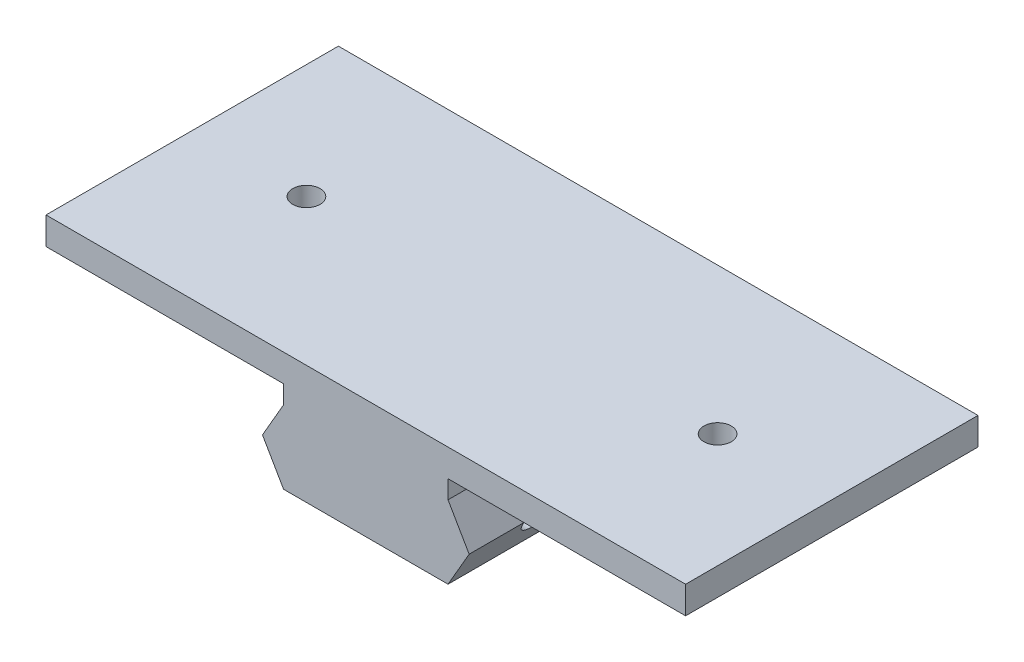
ISO-10303-21;
HEADER;
FILE_DESCRIPTION(('STEP AP214'),'2;1');
FILE_NAME('part.step','',(''),(''),'','','');
FILE_SCHEMA(('AUTOMOTIVE_DESIGN { 1 0 10303 214 1 1 1 1 }'));
ENDSEC;
DATA;
#1=APPLICATION_CONTEXT('core data for automotive mechanical design processes');
#2=APPLICATION_PROTOCOL_DEFINITION('international standard','automotive_design',2000,#1);
#3=PRODUCT_CONTEXT('',#1,'mechanical');
#4=PRODUCT('Part','Part','',(#3));
#5=PRODUCT_RELATED_PRODUCT_CATEGORY('part','',(#4));
#6=PRODUCT_DEFINITION_FORMATION('','',#4);
#7=PRODUCT_DEFINITION_CONTEXT('part definition',#1,'design');
#8=PRODUCT_DEFINITION('design','',#6,#7);
#9=PRODUCT_DEFINITION_SHAPE('','',#8);
#10=(LENGTH_UNIT() NAMED_UNIT(*) SI_UNIT(.MILLI.,.METRE.));
#11=(NAMED_UNIT(*) PLANE_ANGLE_UNIT() SI_UNIT($,.RADIAN.));
#12=(NAMED_UNIT(*) SI_UNIT($,.STERADIAN.) SOLID_ANGLE_UNIT());
#13=UNCERTAINTY_MEASURE_WITH_UNIT(LENGTH_MEASURE(1.E-05),#10,'distance_accuracy_value','');
#14=(GEOMETRIC_REPRESENTATION_CONTEXT(3) GLOBAL_UNCERTAINTY_ASSIGNED_CONTEXT((#13)) GLOBAL_UNIT_ASSIGNED_CONTEXT((#10,
#11,#12)) REPRESENTATION_CONTEXT('',''));
#15=CARTESIAN_POINT('',(0.,0.,0.));
#16=DIRECTION('',(0.,0.,1.));
#17=DIRECTION('',(1.,0.,0.));
#18=AXIS2_PLACEMENT_3D('',#15,#16,#17);
#19=CARTESIAN_POINT('',(11.3094010767585,4.00000000000005,32.));
#20=DIRECTION('',(-0.86602540378444,0.499999999999998,0.));
#21=DIRECTION('',(-0.499999999999998,-0.86602540378444,0.));
#22=AXIS2_PLACEMENT_3D('',#19,#20,#21);
#23=PLANE('',#22);
#24=DIRECTION('',(0.,0.,-1.));
#25=VECTOR('',#24,1.);
#26=CARTESIAN_POINT('',(11.3094010767585,4.00000000000005,32.));
#27=LINE('',#26,#25);
#28=CARTESIAN_POINT('',(11.3094010767585,4.00000000000005,14.));
#29=VERTEX_POINT('',#28);
#30=CARTESIAN_POINT('',(11.3094010767585,4.00000000000005,10.));
#31=VERTEX_POINT('',#30);
#32=EDGE_CURVE('E326',#29,#31,#27,.T.);
#33=ORIENTED_EDGE('',*,*,#32,.F.);
#34=CARTESIAN_POINT('',(11.3094010767585,4.00000000000005,16.));
#35=DIRECTION('',(-0.86602540378444,0.499999999999998,0.));
#36=DIRECTION('',(0.499999999999998,0.86602540378444,0.));
#37=AXIS2_PLACEMENT_3D('',#34,#35,#36);
#38=ELLIPSE('',#37,2.3094010767585,2.);
#39=CARTESIAN_POINT('',(11.3094010767585,4.00000000000005,18.));
#40=VERTEX_POINT('',#39);
#41=EDGE_CURVE('E61',#29,#40,#38,.T.);
#42=ORIENTED_EDGE('',*,*,#41,.T.);
#43=CARTESIAN_POINT('',(11.3094010767585,4.00000000000005,22.));
#44=VERTEX_POINT('',#43);
#45=EDGE_CURVE('E296',#44,#40,#27,.T.);
#46=ORIENTED_EDGE('',*,*,#45,.F.);
#47=CARTESIAN_POINT('',(11.3094010767585,4.00000000000005,24.));
#48=DIRECTION('',(-0.86602540378444,0.499999999999998,0.));
#49=DIRECTION('',(0.499999999999998,0.86602540378444,0.));
#50=AXIS2_PLACEMENT_3D('',#47,#48,#49);
#51=ELLIPSE('',#50,2.3094010767585,2.);
#52=CARTESIAN_POINT('',(11.3094010767585,4.00000000000005,26.));
#53=VERTEX_POINT('',#52);
#54=EDGE_CURVE('E250',#44,#53,#51,.T.);
#55=ORIENTED_EDGE('',*,*,#54,.T.);
#56=CARTESIAN_POINT('',(11.3094010767585,4.00000000000005,32.));
#57=VERTEX_POINT('',#56);
#58=EDGE_CURVE('E292',#57,#53,#27,.T.);
#59=ORIENTED_EDGE('',*,*,#58,.F.);
#60=DIRECTION('',(0.499999999999998,0.86602540378444,0.));
#61=VECTOR('',#60,1.);
#62=CARTESIAN_POINT('',(11.3094010767585,4.00000000000005,32.));
#63=LINE('',#62,#61);
#64=CARTESIAN_POINT('',(9.,0.,32.));
#65=VERTEX_POINT('',#64);
#66=EDGE_CURVE('E254',#65,#57,#63,.T.);
#67=ORIENTED_EDGE('',*,*,#66,.F.);
#68=DIRECTION('',(0.,0.,-1.));
#69=VECTOR('',#68,1.);
#70=CARTESIAN_POINT('',(9.,0.,32.));
#71=LINE('',#70,#69);
#72=CARTESIAN_POINT('',(9.,0.,0.));
#73=VERTEX_POINT('',#72);
#74=EDGE_CURVE('E265',#65,#73,#71,.T.);
#75=ORIENTED_EDGE('',*,*,#74,.T.);
#76=DIRECTION('',(0.499999999999998,0.86602540378444,0.));
#77=VECTOR('',#76,1.);
#78=CARTESIAN_POINT('',(11.3094010767585,4.00000000000005,0.));
#79=LINE('',#78,#77);
#80=CARTESIAN_POINT('',(11.3094010767585,4.00000000000005,0.));
#81=VERTEX_POINT('',#80);
#82=EDGE_CURVE('E253',#73,#81,#79,.T.);
#83=ORIENTED_EDGE('',*,*,#82,.T.);
#84=CARTESIAN_POINT('',(11.3094010767585,4.00000000000005,6.));
#85=VERTEX_POINT('',#84);
#86=EDGE_CURVE('E291',#85,#81,#27,.T.);
#87=ORIENTED_EDGE('',*,*,#86,.F.);
#88=CARTESIAN_POINT('',(11.3094010767585,4.00000000000005,8.));
#89=DIRECTION('',(-0.86602540378444,0.499999999999998,0.));
#90=DIRECTION('',(0.499999999999998,0.86602540378444,0.));
#91=AXIS2_PLACEMENT_3D('',#88,#89,#90);
#92=ELLIPSE('',#91,2.3094010767585,2.);
#93=EDGE_CURVE('E54',#85,#31,#92,.T.);
#94=ORIENTED_EDGE('',*,*,#93,.T.);
#95=EDGE_LOOP('',(#33,#42,#46,#55,#59,#67,#75,#83,#87,#94));
#96=FACE_BOUND('',#95,.T.);
#97=ADVANCED_FACE('F40',(#96),#23,.F.);
#98=CARTESIAN_POINT('',(9.,8.,32.));
#99=DIRECTION('',(-0.866025403784434,-0.500000000000008,0.));
#100=DIRECTION('',(0.500000000000008,-0.866025403784434,0.));
#101=AXIS2_PLACEMENT_3D('',#98,#99,#100);
#102=PLANE('',#101);
#103=ORIENTED_EDGE('',*,*,#45,.T.);
#104=CARTESIAN_POINT('',(11.3094010767585,4.00000000000005,16.));
#105=DIRECTION('',(-0.866025403784434,-0.500000000000008,0.));
#106=DIRECTION('',(0.500000000000008,-0.866025403784434,0.));
#107=AXIS2_PLACEMENT_3D('',#104,#105,#106);
#108=ELLIPSE('',#107,2.30940107675852,2.);
#109=EDGE_CURVE('E241',#40,#29,#108,.T.);
#110=ORIENTED_EDGE('',*,*,#109,.T.);
#111=ORIENTED_EDGE('',*,*,#32,.T.);
#112=CARTESIAN_POINT('',(11.3094010767585,4.00000000000005,8.));
#113=DIRECTION('',(-0.866025403784434,-0.500000000000008,0.));
#114=DIRECTION('',(0.500000000000008,-0.866025403784434,0.));
#115=AXIS2_PLACEMENT_3D('',#112,#113,#114);
#116=ELLIPSE('',#115,2.30940107675852,2.);
#117=EDGE_CURVE('E235',#31,#85,#116,.T.);
#118=ORIENTED_EDGE('',*,*,#117,.T.);
#119=ORIENTED_EDGE('',*,*,#86,.T.);
#120=DIRECTION('',(-0.500000000000008,0.866025403784434,0.));
#121=VECTOR('',#120,1.);
#122=CARTESIAN_POINT('',(9.,8.,0.));
#123=LINE('',#122,#121);
#124=CARTESIAN_POINT('',(9.,8.,0.));
#125=VERTEX_POINT('',#124);
#126=EDGE_CURVE('E268',#81,#125,#123,.T.);
#127=ORIENTED_EDGE('',*,*,#126,.T.);
#128=DIRECTION('',(0.,0.,-1.));
#129=VECTOR('',#128,1.);
#130=CARTESIAN_POINT('',(9.,8.,32.));
#131=LINE('',#130,#129);
#132=CARTESIAN_POINT('',(9.,8.,32.));
#133=VERTEX_POINT('',#132);
#134=EDGE_CURVE('E288',#133,#125,#131,.T.);
#135=ORIENTED_EDGE('',*,*,#134,.F.);
#136=DIRECTION('',(-0.500000000000008,0.866025403784434,0.));
#137=VECTOR('',#136,1.);
#138=CARTESIAN_POINT('',(9.,8.,32.));
#139=LINE('',#138,#137);
#140=EDGE_CURVE('E256',#57,#133,#139,.T.);
#141=ORIENTED_EDGE('',*,*,#140,.F.);
#142=ORIENTED_EDGE('',*,*,#58,.T.);
#143=CARTESIAN_POINT('',(11.3094010767585,4.00000000000005,24.));
#144=DIRECTION('',(-0.866025403784434,-0.500000000000008,0.));
#145=DIRECTION('',(0.500000000000008,-0.866025403784434,0.));
#146=AXIS2_PLACEMENT_3D('',#143,#144,#145);
#147=ELLIPSE('',#146,2.30940107675852,2.);
#148=EDGE_CURVE('E247',#53,#44,#147,.T.);
#149=ORIENTED_EDGE('',*,*,#148,.T.);
#150=EDGE_LOOP('',(#103,#110,#111,#118,#119,#127,#135,#141,#142,#149));
#151=FACE_BOUND('',#150,.T.);
#152=ADVANCED_FACE('F327',(#151),#102,.F.);
#153=CARTESIAN_POINT('',(-11.3094010767585,4.00000000000003,32.));
#154=DIRECTION('',(0.866025403784436,-0.500000000000005,0.));
#155=DIRECTION('',(0.500000000000005,0.866025403784436,0.));
#156=AXIS2_PLACEMENT_3D('',#153,#154,#155);
#157=PLANE('',#156);
#158=DIRECTION('',(0.,0.,-1.));
#159=VECTOR('',#158,1.);
#160=CARTESIAN_POINT('',(-11.3094010767585,4.00000000000003,32.));
#161=LINE('',#160,#159);
#162=CARTESIAN_POINT('',(-11.3094010767585,4.00000000000003,14.));
#163=VERTEX_POINT('',#162);
#164=CARTESIAN_POINT('',(-11.3094010767585,4.00000000000003,10.));
#165=VERTEX_POINT('',#164);
#166=EDGE_CURVE('E306',#163,#165,#161,.T.);
#167=ORIENTED_EDGE('',*,*,#166,.F.);
#168=CARTESIAN_POINT('',(-11.3094010767585,4.00000000000005,16.));
#169=DIRECTION('',(0.866025403784436,-0.500000000000005,0.));
#170=DIRECTION('',(0.500000000000005,0.866025403784436,0.));
#171=AXIS2_PLACEMENT_3D('',#168,#169,#170);
#172=ELLIPSE('',#171,2.30940107675851,2.);
#173=CARTESIAN_POINT('',(-11.3094010767585,4.00000000000003,18.));
#174=VERTEX_POINT('',#173);
#175=EDGE_CURVE('E238',#163,#174,#172,.T.);
#176=ORIENTED_EDGE('',*,*,#175,.T.);
#177=CARTESIAN_POINT('',(-11.3094010767585,4.00000000000003,22.));
#178=VERTEX_POINT('',#177);
#179=EDGE_CURVE('E286',#178,#174,#161,.T.);
#180=ORIENTED_EDGE('',*,*,#179,.F.);
#181=CARTESIAN_POINT('',(-11.3094010767585,4.00000000000005,24.));
#182=DIRECTION('',(0.866025403784436,-0.500000000000005,0.));
#183=DIRECTION('',(0.500000000000005,0.866025403784436,0.));
#184=AXIS2_PLACEMENT_3D('',#181,#182,#183);
#185=ELLIPSE('',#184,2.30940107675851,2.);
#186=CARTESIAN_POINT('',(-11.3094010767585,4.00000000000003,26.));
#187=VERTEX_POINT('',#186);
#188=EDGE_CURVE('E244',#178,#187,#185,.T.);
#189=ORIENTED_EDGE('',*,*,#188,.T.);
#190=CARTESIAN_POINT('',(-11.3094010767585,4.00000000000003,32.));
#191=VERTEX_POINT('',#190);
#192=EDGE_CURVE('E282',#191,#187,#161,.T.);
#193=ORIENTED_EDGE('',*,*,#192,.F.);
#194=DIRECTION('',(-0.500000000000005,-0.866025403784436,0.));
#195=VECTOR('',#194,1.);
#196=CARTESIAN_POINT('',(-11.3094010767585,4.00000000000003,32.));
#197=LINE('',#196,#195);
#198=CARTESIAN_POINT('',(-9.,7.99999999999999,32.));
#199=VERTEX_POINT('',#198);
#200=EDGE_CURVE('E259',#199,#191,#197,.T.);
#201=ORIENTED_EDGE('',*,*,#200,.F.);
#202=DIRECTION('',(0.,0.,-1.));
#203=VECTOR('',#202,1.);
#204=CARTESIAN_POINT('',(-9.,7.99999999999999,32.));
#205=LINE('',#204,#203);
#206=CARTESIAN_POINT('',(-9.,7.99999999999999,0.));
#207=VERTEX_POINT('',#206);
#208=EDGE_CURVE('E285',#199,#207,#205,.T.);
#209=ORIENTED_EDGE('',*,*,#208,.T.);
#210=DIRECTION('',(-0.500000000000005,-0.866025403784436,0.));
#211=VECTOR('',#210,1.);
#212=CARTESIAN_POINT('',(-11.3094010767585,4.00000000000003,0.));
#213=LINE('',#212,#211);
#214=CARTESIAN_POINT('',(-11.3094010767585,4.00000000000003,0.));
#215=VERTEX_POINT('',#214);
#216=EDGE_CURVE('E270',#207,#215,#213,.T.);
#217=ORIENTED_EDGE('',*,*,#216,.T.);
#218=CARTESIAN_POINT('',(-11.3094010767585,4.00000000000003,6.));
#219=VERTEX_POINT('',#218);
#220=EDGE_CURVE('E281',#219,#215,#161,.T.);
#221=ORIENTED_EDGE('',*,*,#220,.F.);
#222=CARTESIAN_POINT('',(-11.3094010767585,4.00000000000005,8.));
#223=DIRECTION('',(0.866025403784436,-0.500000000000005,0.));
#224=DIRECTION('',(0.500000000000005,0.866025403784436,0.));
#225=AXIS2_PLACEMENT_3D('',#222,#223,#224);
#226=ELLIPSE('',#225,2.30940107675851,2.);
#227=EDGE_CURVE('E232',#219,#165,#226,.T.);
#228=ORIENTED_EDGE('',*,*,#227,.T.);
#229=EDGE_LOOP('',(#167,#176,#180,#189,#193,#201,#209,#217,#221,#228));
#230=FACE_BOUND('',#229,.T.);
#231=ADVANCED_FACE('F309',(#230),#157,.F.);
#232=CARTESIAN_POINT('',(-9.,0.,32.));
#233=DIRECTION('',(0.866025403784439,0.499999999999999,0.));
#234=DIRECTION('',(-0.499999999999999,0.866025403784439,0.));
#235=AXIS2_PLACEMENT_3D('',#232,#233,#234);
#236=PLANE('',#235);
#237=ORIENTED_EDGE('',*,*,#179,.T.);
#238=CARTESIAN_POINT('',(-11.3094010767585,4.00000000000005,16.));
#239=DIRECTION('',(0.866025403784439,0.499999999999999,0.));
#240=DIRECTION('',(0.499999999999999,-0.866025403784439,0.));
#241=AXIS2_PLACEMENT_3D('',#238,#239,#240);
#242=ELLIPSE('',#241,2.3094010767585,2.);
#243=EDGE_CURVE('E11',#174,#163,#242,.T.);
#244=ORIENTED_EDGE('',*,*,#243,.T.);
#245=ORIENTED_EDGE('',*,*,#166,.T.);
#246=CARTESIAN_POINT('',(-11.3094010767585,4.00000000000005,8.));
#247=DIRECTION('',(0.866025403784439,0.499999999999999,0.));
#248=DIRECTION('',(0.499999999999999,-0.866025403784439,0.));
#249=AXIS2_PLACEMENT_3D('',#246,#247,#248);
#250=ELLIPSE('',#249,2.3094010767585,2.);
#251=EDGE_CURVE('E48',#165,#219,#250,.T.);
#252=ORIENTED_EDGE('',*,*,#251,.T.);
#253=ORIENTED_EDGE('',*,*,#220,.T.);
#254=DIRECTION('',(0.499999999999999,-0.866025403784439,0.));
#255=VECTOR('',#254,1.);
#256=CARTESIAN_POINT('',(-9.,0.,0.));
#257=LINE('',#256,#255);
#258=CARTESIAN_POINT('',(-9.,0.,0.));
#259=VERTEX_POINT('',#258);
#260=EDGE_CURVE('E273',#215,#259,#257,.T.);
#261=ORIENTED_EDGE('',*,*,#260,.T.);
#262=DIRECTION('',(0.,0.,-1.));
#263=VECTOR('',#262,1.);
#264=CARTESIAN_POINT('',(-9.,0.,32.));
#265=LINE('',#264,#263);
#266=CARTESIAN_POINT('',(-9.,0.,32.));
#267=VERTEX_POINT('',#266);
#268=EDGE_CURVE('E278',#267,#259,#265,.T.);
#269=ORIENTED_EDGE('',*,*,#268,.F.);
#270=DIRECTION('',(0.499999999999999,-0.866025403784439,0.));
#271=VECTOR('',#270,1.);
#272=CARTESIAN_POINT('',(-9.,0.,32.));
#273=LINE('',#272,#271);
#274=EDGE_CURVE('E261',#191,#267,#273,.T.);
#275=ORIENTED_EDGE('',*,*,#274,.F.);
#276=ORIENTED_EDGE('',*,*,#192,.T.);
#277=CARTESIAN_POINT('',(-11.3094010767585,4.00000000000005,24.));
#278=DIRECTION('',(0.866025403784439,0.499999999999999,0.));
#279=DIRECTION('',(0.499999999999999,-0.866025403784439,0.));
#280=AXIS2_PLACEMENT_3D('',#277,#278,#279);
#281=ELLIPSE('',#280,2.3094010767585,2.);
#282=EDGE_CURVE('E295',#187,#178,#281,.T.);
#283=ORIENTED_EDGE('',*,*,#282,.T.);
#284=EDGE_LOOP('',(#237,#244,#245,#252,#253,#261,#269,#275,#276,#283));
#285=FACE_BOUND('',#284,.T.);
#286=ADVANCED_FACE('F304',(#285),#236,.F.);
#287=CARTESIAN_POINT('',(9.,0.,32.));
#288=DIRECTION('',(0.,1.,0.));
#289=DIRECTION('',(-1.,0.,0.));
#290=AXIS2_PLACEMENT_3D('',#287,#288,#289);
#291=PLANE('',#290);
#292=DIRECTION('',(1.,0.,0.));
#293=VECTOR('',#292,1.);
#294=CARTESIAN_POINT('',(9.,0.,0.));
#295=LINE('',#294,#293);
#296=EDGE_CURVE('E257',#259,#73,#295,.T.);
#297=ORIENTED_EDGE('',*,*,#296,.T.);
#298=ORIENTED_EDGE('',*,*,#74,.F.);
#299=DIRECTION('',(1.,0.,0.));
#300=VECTOR('',#299,1.);
#301=CARTESIAN_POINT('',(9.,0.,32.));
#302=LINE('',#301,#300);
#303=EDGE_CURVE('E263',#267,#65,#302,.T.);
#304=ORIENTED_EDGE('',*,*,#303,.F.);
#305=ORIENTED_EDGE('',*,*,#268,.T.);
#306=EDGE_LOOP('',(#297,#298,#304,#305));
#307=FACE_BOUND('',#306,.T.);
#308=ADVANCED_FACE('F341',(#307),#291,.F.);
#309=CARTESIAN_POINT('',(0.,0.,32.));
#310=DIRECTION('',(0.,0.,-1.));
#311=DIRECTION('',(-1.,0.,0.));
#312=AXIS2_PLACEMENT_3D('',#309,#310,#311);
#313=PLANE('',#312);
#314=ORIENTED_EDGE('',*,*,#66,.T.);
#315=ORIENTED_EDGE('',*,*,#140,.T.);
#316=DIRECTION('',(0.,-1.,0.));
#317=VECTOR('',#316,1.);
#318=CARTESIAN_POINT('',(9.,8.,32.));
#319=LINE('',#318,#317);
#320=CARTESIAN_POINT('',(9.,10.,32.));
#321=VERTEX_POINT('',#320);
#322=EDGE_CURVE('E172',#321,#133,#319,.T.);
#323=ORIENTED_EDGE('',*,*,#322,.F.);
#324=DIRECTION('',(1.,0.,0.));
#325=VECTOR('',#324,1.);
#326=CARTESIAN_POINT('',(-35.,10.,32.));
#327=LINE('',#326,#325);
#328=CARTESIAN_POINT('',(35.,10.,32.));
#329=VERTEX_POINT('',#328);
#330=EDGE_CURVE('E165',#321,#329,#327,.T.);
#331=ORIENTED_EDGE('',*,*,#330,.T.);
#332=DIRECTION('',(0.,-1.,0.));
#333=VECTOR('',#332,1.);
#334=CARTESIAN_POINT('',(35.,10.,32.));
#335=LINE('',#334,#333);
#336=CARTESIAN_POINT('',(35.,13.,32.));
#337=VERTEX_POINT('',#336);
#338=EDGE_CURVE('E170',#337,#329,#335,.T.);
#339=ORIENTED_EDGE('',*,*,#338,.F.);
#340=DIRECTION('',(1.,0.,0.));
#341=VECTOR('',#340,1.);
#342=CARTESIAN_POINT('',(-35.,13.,32.));
#343=LINE('',#342,#341);
#344=CARTESIAN_POINT('',(-35.,13.,32.));
#345=VERTEX_POINT('',#344);
#346=EDGE_CURVE('E211',#345,#337,#343,.T.);
#347=ORIENTED_EDGE('',*,*,#346,.F.);
#348=DIRECTION('',(0.,-1.,0.));
#349=VECTOR('',#348,1.);
#350=CARTESIAN_POINT('',(-35.,10.,32.));
#351=LINE('',#350,#349);
#352=CARTESIAN_POINT('',(-35.,10.,32.));
#353=VERTEX_POINT('',#352);
#354=EDGE_CURVE('E200',#345,#353,#351,.T.);
#355=ORIENTED_EDGE('',*,*,#354,.T.);
#356=CARTESIAN_POINT('',(-9.,10.,32.));
#357=VERTEX_POINT('',#356);
#358=EDGE_CURVE('E175',#353,#357,#327,.T.);
#359=ORIENTED_EDGE('',*,*,#358,.T.);
#360=DIRECTION('',(0.,-1.,0.));
#361=VECTOR('',#360,1.);
#362=CARTESIAN_POINT('',(-9.,8.,32.));
#363=LINE('',#362,#361);
#364=EDGE_CURVE('E213',#357,#199,#363,.T.);
#365=ORIENTED_EDGE('',*,*,#364,.T.);
#366=ORIENTED_EDGE('',*,*,#200,.T.);
#367=ORIENTED_EDGE('',*,*,#274,.T.);
#368=ORIENTED_EDGE('',*,*,#303,.T.);
#369=EDGE_LOOP('',(#314,#315,#323,#331,#339,#347,#355,#359,#365,#366,#367,#368));
#370=FACE_BOUND('',#369,.T.);
#371=ADVANCED_FACE('F168',(#370),#313,.F.);
#372=CARTESIAN_POINT('',(0.,0.,0.));
#373=DIRECTION('',(0.,0.,-1.));
#374=DIRECTION('',(-1.,0.,0.));
#375=AXIS2_PLACEMENT_3D('',#372,#373,#374);
#376=PLANE('',#375);
#377=ORIENTED_EDGE('',*,*,#82,.F.);
#378=ORIENTED_EDGE('',*,*,#296,.F.);
#379=ORIENTED_EDGE('',*,*,#260,.F.);
#380=ORIENTED_EDGE('',*,*,#216,.F.);
#381=DIRECTION('',(0.,1.,0.));
#382=VECTOR('',#381,1.);
#383=CARTESIAN_POINT('',(-9.,8.,0.));
#384=LINE('',#383,#382);
#385=CARTESIAN_POINT('',(-9.,10.,0.));
#386=VERTEX_POINT('',#385);
#387=EDGE_CURVE('E221',#207,#386,#384,.T.);
#388=ORIENTED_EDGE('',*,*,#387,.T.);
#389=DIRECTION('',(1.,0.,0.));
#390=VECTOR('',#389,1.);
#391=CARTESIAN_POINT('',(-35.,10.,0.));
#392=LINE('',#391,#390);
#393=CARTESIAN_POINT('',(-35.,10.,0.));
#394=VERTEX_POINT('',#393);
#395=EDGE_CURVE('E216',#394,#386,#392,.T.);
#396=ORIENTED_EDGE('',*,*,#395,.F.);
#397=DIRECTION('',(0.,1.,0.));
#398=VECTOR('',#397,1.);
#399=CARTESIAN_POINT('',(-35.,10.,0.));
#400=LINE('',#399,#398);
#401=CARTESIAN_POINT('',(-35.,13.,0.));
#402=VERTEX_POINT('',#401);
#403=EDGE_CURVE('E206',#394,#402,#400,.T.);
#404=ORIENTED_EDGE('',*,*,#403,.T.);
#405=DIRECTION('',(1.,0.,0.));
#406=VECTOR('',#405,1.);
#407=CARTESIAN_POINT('',(-35.,13.,0.));
#408=LINE('',#407,#406);
#409=CARTESIAN_POINT('',(35.,13.,0.));
#410=VERTEX_POINT('',#409);
#411=EDGE_CURVE('E214',#402,#410,#408,.T.);
#412=ORIENTED_EDGE('',*,*,#411,.T.);
#413=DIRECTION('',(0.,1.,0.));
#414=VECTOR('',#413,1.);
#415=CARTESIAN_POINT('',(35.,10.,0.));
#416=LINE('',#415,#414);
#417=CARTESIAN_POINT('',(35.,10.,0.));
#418=VERTEX_POINT('',#417);
#419=EDGE_CURVE('E186',#418,#410,#416,.T.);
#420=ORIENTED_EDGE('',*,*,#419,.F.);
#421=CARTESIAN_POINT('',(9.,10.,0.));
#422=VERTEX_POINT('',#421);
#423=EDGE_CURVE('E182',#422,#418,#392,.T.);
#424=ORIENTED_EDGE('',*,*,#423,.F.);
#425=DIRECTION('',(0.,1.,0.));
#426=VECTOR('',#425,1.);
#427=CARTESIAN_POINT('',(9.,8.,0.));
#428=LINE('',#427,#426);
#429=EDGE_CURVE('E227',#125,#422,#428,.T.);
#430=ORIENTED_EDGE('',*,*,#429,.F.);
#431=ORIENTED_EDGE('',*,*,#126,.F.);
#432=EDGE_LOOP('',(#377,#378,#379,#380,#388,#396,#404,#412,#420,#424,#430,#431));
#433=FACE_BOUND('',#432,.T.);
#434=ADVANCED_FACE('F334',(#433),#376,.T.);
#435=CARTESIAN_POINT('',(-11.3094010767585,4.00000000000005,24.));
#436=DIRECTION('',(1.,0.,0.));
#437=DIRECTION('',(0.,0.,-1.));
#438=AXIS2_PLACEMENT_3D('',#435,#436,#437);
#439=CYLINDRICAL_SURFACE('',#438,2.);
#440=ORIENTED_EDGE('',*,*,#282,.F.);
#441=ORIENTED_EDGE('',*,*,#188,.F.);
#442=EDGE_LOOP('',(#440,#441));
#443=FACE_BOUND('',#442,.T.);
#444=ORIENTED_EDGE('',*,*,#148,.F.);
#445=ORIENTED_EDGE('',*,*,#54,.F.);
#446=EDGE_LOOP('',(#444,#445));
#447=FACE_BOUND('',#446,.T.);
#448=ADVANCED_FACE('F362',(#443,#447),#439,.F.);
#449=CARTESIAN_POINT('',(-11.3094010767585,4.00000000000005,8.));
#450=DIRECTION('',(1.,0.,0.));
#451=DIRECTION('',(0.,0.,-1.));
#452=AXIS2_PLACEMENT_3D('',#449,#450,#451);
#453=CYLINDRICAL_SURFACE('',#452,2.);
#454=ORIENTED_EDGE('',*,*,#251,.F.);
#455=ORIENTED_EDGE('',*,*,#227,.F.);
#456=EDGE_LOOP('',(#454,#455));
#457=FACE_BOUND('',#456,.T.);
#458=ORIENTED_EDGE('',*,*,#117,.F.);
#459=ORIENTED_EDGE('',*,*,#93,.F.);
#460=EDGE_LOOP('',(#458,#459));
#461=FACE_BOUND('',#460,.T.);
#462=ADVANCED_FACE('F318',(#457,#461),#453,.F.);
#463=CARTESIAN_POINT('',(-11.3094010767585,4.00000000000005,16.));
#464=DIRECTION('',(1.,0.,0.));
#465=DIRECTION('',(0.,0.,-1.));
#466=AXIS2_PLACEMENT_3D('',#463,#464,#465);
#467=CYLINDRICAL_SURFACE('',#466,2.);
#468=ORIENTED_EDGE('',*,*,#243,.F.);
#469=ORIENTED_EDGE('',*,*,#175,.F.);
#470=EDGE_LOOP('',(#468,#469));
#471=FACE_BOUND('',#470,.T.);
#472=ORIENTED_EDGE('',*,*,#109,.F.);
#473=ORIENTED_EDGE('',*,*,#41,.F.);
#474=EDGE_LOOP('',(#472,#473));
#475=FACE_BOUND('',#474,.T.);
#476=ADVANCED_FACE('F315',(#471,#475),#467,.F.);
#477=CARTESIAN_POINT('',(9.,0.,0.));
#478=DIRECTION('',(-1.,0.,0.));
#479=DIRECTION('',(0.,0.,1.));
#480=AXIS2_PLACEMENT_3D('',#477,#478,#479);
#481=PLANE('',#480);
#482=ORIENTED_EDGE('',*,*,#322,.T.);
#483=ORIENTED_EDGE('',*,*,#134,.T.);
#484=ORIENTED_EDGE('',*,*,#429,.T.);
#485=DIRECTION('',(0.,0.,1.));
#486=VECTOR('',#485,1.);
#487=CARTESIAN_POINT('',(9.,10.,32.));
#488=LINE('',#487,#486);
#489=EDGE_CURVE('E230',#422,#321,#488,.T.);
#490=ORIENTED_EDGE('',*,*,#489,.T.);
#491=EDGE_LOOP('',(#482,#483,#484,#490));
#492=FACE_BOUND('',#491,.T.);
#493=ADVANCED_FACE('F317',(#492),#481,.F.);
#494=CARTESIAN_POINT('',(-9.,0.,0.));
#495=DIRECTION('',(-1.,0.,0.));
#496=DIRECTION('',(0.,0.,1.));
#497=AXIS2_PLACEMENT_3D('',#494,#495,#496);
#498=PLANE('',#497);
#499=ORIENTED_EDGE('',*,*,#364,.F.);
#500=DIRECTION('',(0.,0.,1.));
#501=VECTOR('',#500,1.);
#502=CARTESIAN_POINT('',(-9.,10.,32.));
#503=LINE('',#502,#501);
#504=EDGE_CURVE('E224',#386,#357,#503,.T.);
#505=ORIENTED_EDGE('',*,*,#504,.F.);
#506=ORIENTED_EDGE('',*,*,#387,.F.);
#507=ORIENTED_EDGE('',*,*,#208,.F.);
#508=EDGE_LOOP('',(#499,#505,#506,#507));
#509=FACE_BOUND('',#508,.T.);
#510=ADVANCED_FACE('F348',(#509),#498,.T.);
#511=CARTESIAN_POINT('',(-35.,10.,32.));
#512=DIRECTION('',(0.,-1.,0.));
#513=DIRECTION('',(0.,0.,-1.));
#514=AXIS2_PLACEMENT_3D('',#511,#512,#513);
#515=PLANE('',#514);
#516=CARTESIAN_POINT('',(22.5,10.,16.));
#517=DIRECTION('',(0.,-1.,0.));
#518=DIRECTION('',(0.,0.,-1.));
#519=AXIS2_PLACEMENT_3D('',#516,#517,#518);
#520=CIRCLE('',#519,1.5);
#521=CARTESIAN_POINT('',(22.5,10.,14.5));
#522=VERTEX_POINT('',#521);
#523=EDGE_CURVE('E192',#522,#522,#520,.T.);
#524=ORIENTED_EDGE('',*,*,#523,.F.);
#525=EDGE_LOOP('',(#524));
#526=FACE_BOUND('',#525,.T.);
#527=ORIENTED_EDGE('',*,*,#489,.F.);
#528=ORIENTED_EDGE('',*,*,#423,.T.);
#529=DIRECTION('',(0.,0.,-1.));
#530=VECTOR('',#529,1.);
#531=CARTESIAN_POINT('',(35.,10.,32.));
#532=LINE('',#531,#530);
#533=EDGE_CURVE('E179',#329,#418,#532,.T.);
#534=ORIENTED_EDGE('',*,*,#533,.F.);
#535=ORIENTED_EDGE('',*,*,#330,.F.);
#536=EDGE_LOOP('',(#527,#528,#534,#535));
#537=FACE_BOUND('',#536,.T.);
#538=ADVANCED_FACE('F180',(#526,#537),#515,.T.);
#539=CARTESIAN_POINT('',(-35.,13.,32.));
#540=DIRECTION('',(0.,1.,0.));
#541=DIRECTION('',(0.,0.,1.));
#542=AXIS2_PLACEMENT_3D('',#539,#540,#541);
#543=PLANE('',#542);
#544=CARTESIAN_POINT('',(-22.5,13.,16.));
#545=DIRECTION('',(0.,1.,0.));
#546=DIRECTION('',(0.,0.,1.));
#547=AXIS2_PLACEMENT_3D('',#544,#545,#546);
#548=CIRCLE('',#547,1.5);
#549=CARTESIAN_POINT('',(-22.5,13.,17.5));
#550=VERTEX_POINT('',#549);
#551=EDGE_CURVE('E536',#550,#550,#548,.T.);
#552=ORIENTED_EDGE('',*,*,#551,.F.);
#553=EDGE_LOOP('',(#552));
#554=FACE_BOUND('',#553,.T.);
#555=CARTESIAN_POINT('',(22.5,13.,16.));
#556=DIRECTION('',(0.,1.,0.));
#557=DIRECTION('',(0.,0.,1.));
#558=AXIS2_PLACEMENT_3D('',#555,#556,#557);
#559=CIRCLE('',#558,1.5);
#560=CARTESIAN_POINT('',(22.5,13.,17.5));
#561=VERTEX_POINT('',#560);
#562=EDGE_CURVE('E534',#561,#561,#559,.T.);
#563=ORIENTED_EDGE('',*,*,#562,.F.);
#564=EDGE_LOOP('',(#563));
#565=FACE_BOUND('',#564,.T.);
#566=ORIENTED_EDGE('',*,*,#346,.T.);
#567=DIRECTION('',(0.,0.,1.));
#568=VECTOR('',#567,1.);
#569=CARTESIAN_POINT('',(35.,13.,32.));
#570=LINE('',#569,#568);
#571=EDGE_CURVE('E191',#410,#337,#570,.T.);
#572=ORIENTED_EDGE('',*,*,#571,.F.);
#573=ORIENTED_EDGE('',*,*,#411,.F.);
#574=DIRECTION('',(0.,0.,1.));
#575=VECTOR('',#574,1.);
#576=CARTESIAN_POINT('',(-35.,13.,32.));
#577=LINE('',#576,#575);
#578=EDGE_CURVE('E176',#402,#345,#577,.T.);
#579=ORIENTED_EDGE('',*,*,#578,.T.);
#580=EDGE_LOOP('',(#566,#572,#573,#579));
#581=FACE_BOUND('',#580,.T.);
#582=ADVANCED_FACE('F359',(#554,#565,#581),#543,.T.);
#583=CARTESIAN_POINT('',(-22.5,10.,16.));
#584=DIRECTION('',(0.,-1.,0.));
#585=DIRECTION('',(0.,0.,-1.));
#586=AXIS2_PLACEMENT_3D('',#583,#584,#585);
#587=CIRCLE('',#586,1.5);
#588=CARTESIAN_POINT('',(-22.5,10.,14.5));
#589=VERTEX_POINT('',#588);
#590=EDGE_CURVE('E43',#589,#589,#587,.T.);
#591=ORIENTED_EDGE('',*,*,#590,.F.);
#592=EDGE_LOOP('',(#591));
#593=FACE_BOUND('',#592,.T.);
#594=ORIENTED_EDGE('',*,*,#395,.T.);
#595=ORIENTED_EDGE('',*,*,#504,.T.);
#596=ORIENTED_EDGE('',*,*,#358,.F.);
#597=DIRECTION('',(0.,0.,-1.));
#598=VECTOR('',#597,1.);
#599=CARTESIAN_POINT('',(-35.,10.,32.));
#600=LINE('',#599,#598);
#601=EDGE_CURVE('E203',#353,#394,#600,.T.);
#602=ORIENTED_EDGE('',*,*,#601,.T.);
#603=EDGE_LOOP('',(#594,#595,#596,#602));
#604=FACE_BOUND('',#603,.T.);
#605=ADVANCED_FACE('F357',(#593,#604),#515,.T.);
#606=CARTESIAN_POINT('',(-35.,0.,0.));
#607=DIRECTION('',(-1.,0.,0.));
#608=DIRECTION('',(0.,0.,1.));
#609=AXIS2_PLACEMENT_3D('',#606,#607,#608);
#610=PLANE('',#609);
#611=ORIENTED_EDGE('',*,*,#354,.F.);
#612=ORIENTED_EDGE('',*,*,#578,.F.);
#613=ORIENTED_EDGE('',*,*,#403,.F.);
#614=ORIENTED_EDGE('',*,*,#601,.F.);
#615=EDGE_LOOP('',(#611,#612,#613,#614));
#616=FACE_BOUND('',#615,.T.);
#617=ADVANCED_FACE('F356',(#616),#610,.T.);
#618=CARTESIAN_POINT('',(35.,0.,0.));
#619=DIRECTION('',(-1.,0.,0.));
#620=DIRECTION('',(0.,0.,1.));
#621=AXIS2_PLACEMENT_3D('',#618,#619,#620);
#622=PLANE('',#621);
#623=ORIENTED_EDGE('',*,*,#338,.T.);
#624=ORIENTED_EDGE('',*,*,#533,.T.);
#625=ORIENTED_EDGE('',*,*,#419,.T.);
#626=ORIENTED_EDGE('',*,*,#571,.T.);
#627=EDGE_LOOP('',(#623,#624,#625,#626));
#628=FACE_BOUND('',#627,.T.);
#629=ADVANCED_FACE('F189',(#628),#622,.F.);
#630=CARTESIAN_POINT('',(-22.5,3.,16.));
#631=DIRECTION('',(0.,1.,0.));
#632=DIRECTION('',(0.,0.,1.));
#633=AXIS2_PLACEMENT_3D('',#630,#631,#632);
#634=CYLINDRICAL_SURFACE('',#633,1.5);
#635=ORIENTED_EDGE('',*,*,#590,.T.);
#636=EDGE_LOOP('',(#635));
#637=FACE_BOUND('',#636,.T.);
#638=ORIENTED_EDGE('',*,*,#551,.T.);
#639=EDGE_LOOP('',(#638));
#640=FACE_BOUND('',#639,.T.);
#641=ADVANCED_FACE('F425',(#637,#640),#634,.F.);
#642=CARTESIAN_POINT('',(22.5,3.,16.));
#643=DIRECTION('',(0.,1.,0.));
#644=DIRECTION('',(0.,0.,1.));
#645=AXIS2_PLACEMENT_3D('',#642,#643,#644);
#646=CYLINDRICAL_SURFACE('',#645,1.5);
#647=ORIENTED_EDGE('',*,*,#523,.T.);
#648=EDGE_LOOP('',(#647));
#649=FACE_BOUND('',#648,.T.);
#650=ORIENTED_EDGE('',*,*,#562,.T.);
#651=EDGE_LOOP('',(#650));
#652=FACE_BOUND('',#651,.T.);
#653=ADVANCED_FACE('F454',(#649,#652),#646,.F.);
#654=CLOSED_SHELL('',(#97,#152,#231,#286,#308,#371,#434,#448,#462,#476,#493,#510,#538,#582,#605,
#617,#629,#641,#653));
#655=MANIFOLD_SOLID_BREP('B2',#654);
#656=ADVANCED_BREP_SHAPE_REPRESENTATION('',(#18,#655),#14);
#657=SHAPE_DEFINITION_REPRESENTATION(#9,#656);
ENDSEC;
END-ISO-10303-21;
